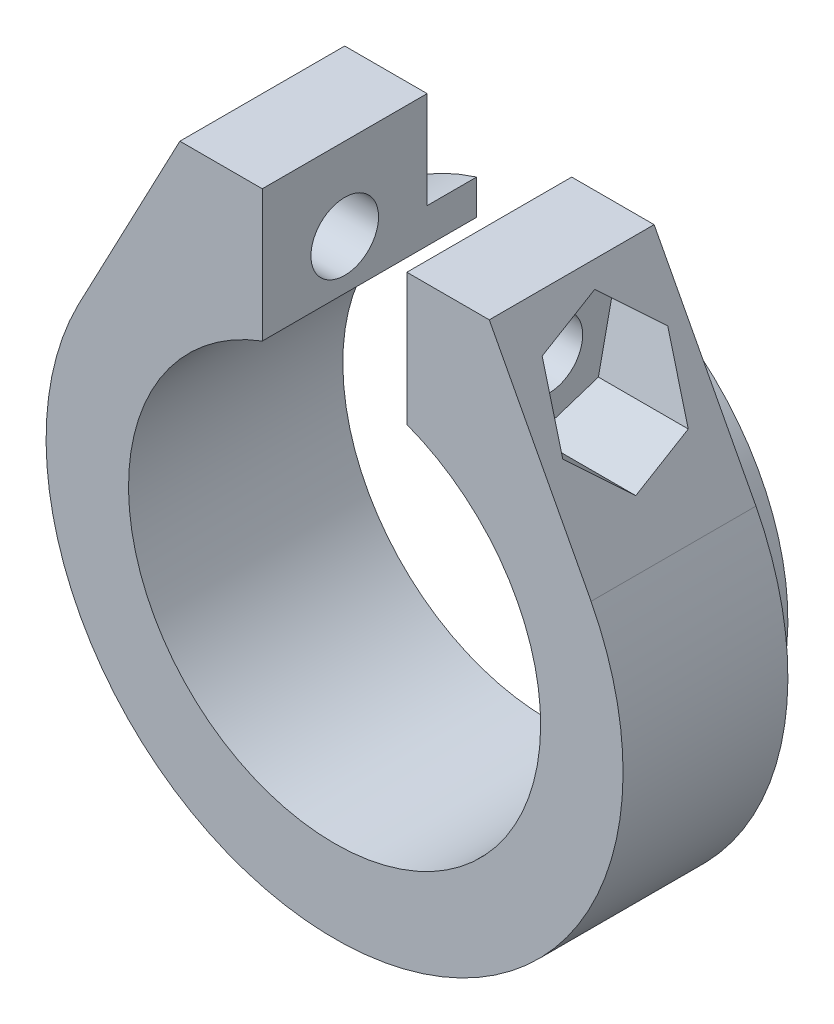
ISO-10303-21;
HEADER;
FILE_DESCRIPTION(('STEP AP214'),'2;1');
FILE_NAME('part.step','',(''),(''),'','','');
FILE_SCHEMA(('AUTOMOTIVE_DESIGN { 1 0 10303 214 1 1 1 1 }'));
ENDSEC;
DATA;
#1=APPLICATION_CONTEXT('core data for automotive mechanical design processes');
#2=APPLICATION_PROTOCOL_DEFINITION('international standard','automotive_design',2000,#1);
#3=PRODUCT_CONTEXT('',#1,'mechanical');
#4=PRODUCT('Part','Part','',(#3));
#5=PRODUCT_RELATED_PRODUCT_CATEGORY('part','',(#4));
#6=PRODUCT_DEFINITION_FORMATION('','',#4);
#7=PRODUCT_DEFINITION_CONTEXT('part definition',#1,'design');
#8=PRODUCT_DEFINITION('design','',#6,#7);
#9=PRODUCT_DEFINITION_SHAPE('','',#8);
#10=(LENGTH_UNIT() NAMED_UNIT(*) SI_UNIT(.MILLI.,.METRE.));
#11=(NAMED_UNIT(*) PLANE_ANGLE_UNIT() SI_UNIT($,.RADIAN.));
#12=(NAMED_UNIT(*) SI_UNIT($,.STERADIAN.) SOLID_ANGLE_UNIT());
#13=UNCERTAINTY_MEASURE_WITH_UNIT(LENGTH_MEASURE(1.E-05),#10,'distance_accuracy_value','');
#14=(GEOMETRIC_REPRESENTATION_CONTEXT(3) GLOBAL_UNCERTAINTY_ASSIGNED_CONTEXT((#13)) GLOBAL_UNIT_ASSIGNED_CONTEXT((#10,
#11,#12)) REPRESENTATION_CONTEXT('',''));
#15=CARTESIAN_POINT('',(0.,0.,0.));
#16=DIRECTION('',(0.,0.,1.));
#17=DIRECTION('',(1.,0.,0.));
#18=AXIS2_PLACEMENT_3D('',#15,#16,#17);
#19=CARTESIAN_POINT('',(-17.5,14.705801524784,5.));
#20=DIRECTION('',(1.,0.,0.));
#21=DIRECTION('',(0.,0.,-1.));
#22=AXIS2_PLACEMENT_3D('',#19,#20,#21);
#23=CYLINDRICAL_SURFACE('',#22,2.05);
#24=CARTESIAN_POINT('',(4.38454224091464,14.705801524784,5.));
#25=DIRECTION('',(1.,0.,0.));
#26=DIRECTION('',(0.,1.,0.));
#27=AXIS2_PLACEMENT_3D('',#24,#25,#26);
#28=CIRCLE('',#27,2.05);
#29=CARTESIAN_POINT('',(4.38454224091464,16.755801524784,5.));
#30=VERTEX_POINT('',#29);
#31=EDGE_CURVE('E232',#30,#30,#28,.T.);
#32=ORIENTED_EDGE('',*,*,#31,.F.);
#33=EDGE_LOOP('',(#32));
#34=FACE_BOUND('',#33,.T.);
#35=CARTESIAN_POINT('',(8.,14.705801524784,5.));
#36=DIRECTION('',(1.,0.,0.));
#37=DIRECTION('',(0.,0.,-1.));
#38=AXIS2_PLACEMENT_3D('',#35,#36,#37);
#39=CIRCLE('',#38,2.05);
#40=CARTESIAN_POINT('',(8.,14.705801524784,2.95));
#41=VERTEX_POINT('',#40);
#42=EDGE_CURVE('E211',#41,#41,#39,.F.);
#43=ORIENTED_EDGE('',*,*,#42,.F.);
#44=EDGE_LOOP('',(#43));
#45=FACE_BOUND('',#44,.T.);
#46=ADVANCED_FACE('F44',(#34,#45),#23,.F.);
#47=CARTESIAN_POINT('',(0.,0.,10.));
#48=DIRECTION('',(0.,0.,-1.));
#49=DIRECTION('',(-1.,0.,0.));
#50=AXIS2_PLACEMENT_3D('',#47,#48,#49);
#51=CYLINDRICAL_SURFACE('',#50,17.5);
#52=CARTESIAN_POINT('',(0.,0.,0.));
#53=DIRECTION('',(0.,0.,1.));
#54=DIRECTION('',(1.,0.,0.));
#55=AXIS2_PLACEMENT_3D('',#52,#53,#54);
#56=CIRCLE('',#55,17.5);
#57=CARTESIAN_POINT('',(-15.5608994388534,8.00677267404855,0.));
#58=VERTEX_POINT('',#57);
#59=CARTESIAN_POINT('',(15.5608994388534,8.00677267404855,0.));
#60=VERTEX_POINT('',#59);
#61=EDGE_CURVE('E236',#58,#60,#56,.T.);
#62=ORIENTED_EDGE('',*,*,#61,.T.);
#63=DIRECTION('',(0.,0.,-1.));
#64=VECTOR('',#63,1.);
#65=CARTESIAN_POINT('',(15.5608994388534,8.00677267404855,10.));
#66=LINE('',#65,#64);
#67=CARTESIAN_POINT('',(15.5608994388534,8.00677267404855,10.));
#68=VERTEX_POINT('',#67);
#69=EDGE_CURVE('E286',#68,#60,#66,.T.);
#70=ORIENTED_EDGE('',*,*,#69,.F.);
#71=CARTESIAN_POINT('',(0.,0.,10.));
#72=DIRECTION('',(0.,0.,1.));
#73=DIRECTION('',(1.,0.,0.));
#74=AXIS2_PLACEMENT_3D('',#71,#72,#73);
#75=CIRCLE('',#74,17.5);
#76=CARTESIAN_POINT('',(-15.5608994388534,8.00677267404855,10.));
#77=VERTEX_POINT('',#76);
#78=EDGE_CURVE('E237',#77,#68,#75,.T.);
#79=ORIENTED_EDGE('',*,*,#78,.F.);
#80=DIRECTION('',(0.,0.,-1.));
#81=VECTOR('',#80,1.);
#82=CARTESIAN_POINT('',(-15.5608994388534,8.00677267404855,10.));
#83=LINE('',#82,#81);
#84=EDGE_CURVE('E256',#77,#58,#83,.T.);
#85=ORIENTED_EDGE('',*,*,#84,.T.);
#86=EDGE_LOOP('',(#62,#70,#79,#85));
#87=FACE_BOUND('',#86,.T.);
#88=ADVANCED_FACE('F46',(#87),#51,.T.);
#89=CARTESIAN_POINT('',(15.5608994388534,8.00677267404855,10.));
#90=DIRECTION('',(-0.884326404159243,-0.466869158230422,0.));
#91=DIRECTION('',(0.466869158230422,-0.884326404159243,0.));
#92=AXIS2_PLACEMENT_3D('',#89,#90,#91);
#93=PLANE('',#92);
#94=DIRECTION('',(0.458850828402479,-0.869138378437038,0.184538333151124));
#95=VECTOR('',#94,1.);
#96=CARTESIAN_POINT('',(16.1668092173525,6.85908063609954,3.08801928125686));
#97=LINE('',#96,#95);
#98=CARTESIAN_POINT('',(11.3644480736843,15.955536649067,1.15662967534137));
#99=VERTEX_POINT('',#98);
#100=CARTESIAN_POINT('',(13.4515563998253,12.0022127496199,1.99601247203986));
#101=VERTEX_POINT('',#100);
#102=EDGE_CURVE('E289',#99,#101,#97,.T.);
#103=ORIENTED_EDGE('',*,*,#102,.T.);
#104=DIRECTION('',(0.16112078627816,-0.305189072897278,0.938562582896424));
#105=VECTOR('',#104,1.);
#106=CARTESIAN_POINT('',(14.9131582744826,9.23370018599896,10.5101518474291));
#107=LINE('',#106,#105);
#108=CARTESIAN_POINT('',(14.1113385602819,10.7524776253368,5.83938279669849));
#109=VERTEX_POINT('',#108);
#110=EDGE_CURVE('E48',#101,#109,#107,.T.);
#111=ORIENTED_EDGE('',*,*,#110,.T.);
#112=DIRECTION('',(-0.333013343699275,0.63078163887896,0.700868487643296));
#113=VECTOR('',#112,1.);
#114=CARTESIAN_POINT('',(13.877768961011,11.1948965776341,6.33095941036211));
#115=LINE('',#114,#113);
#116=CARTESIAN_POINT('',(12.6840123945975,13.4560664005009,8.84337032465863));
#117=VERTEX_POINT('',#116);
#118=EDGE_CURVE('E306',#109,#117,#115,.T.);
#119=ORIENTED_EDGE('',*,*,#118,.T.);
#120=DIRECTION('',(-0.458850828402479,0.869138378437038,-0.184538333151124));
#121=VECTOR('',#120,1.);
#122=CARTESIAN_POINT('',(15.560867060657,8.00683400363851,10.0003693577452));
#123=LINE('',#122,#121);
#124=CARTESIAN_POINT('',(10.5969040684565,17.4093902999481,8.00398752796013));
#125=VERTEX_POINT('',#124);
#126=EDGE_CURVE('E304',#117,#125,#123,.T.);
#127=ORIENTED_EDGE('',*,*,#126,.T.);
#128=DIRECTION('',(-0.16112078627816,0.305189072897278,-0.938562582896424));
#129=VECTOR('',#128,1.);
#130=CARTESIAN_POINT('',(11.4899581779318,15.7178000215384,13.2062161852131));
#131=LINE('',#130,#129);
#132=CARTESIAN_POINT('',(9.9371219079999,18.6591254242311,4.1606172033015));
#133=VERTEX_POINT('',#132);
#134=EDGE_CURVE('E301',#125,#133,#131,.T.);
#135=ORIENTED_EDGE('',*,*,#134,.T.);
#136=DIRECTION('',(0.333013343699275,-0.63078163887896,-0.700868487643296));
#137=VECTOR('',#136,1.);
#138=CARTESIAN_POINT('',(11.435502825422,15.8209473492709,1.00708600890118));
#139=LINE('',#138,#137);
#140=EDGE_CURVE('E298',#133,#99,#139,.T.);
#141=ORIENTED_EDGE('',*,*,#140,.T.);
#142=EDGE_LOOP('',(#103,#111,#119,#127,#135,#141));
#143=FACE_BOUND('',#142,.T.);
#144=DIRECTION('',(-0.466869158230422,0.884326404159243,0.));
#145=VECTOR('',#144,1.);
#146=CARTESIAN_POINT('',(15.5608994388534,8.00677267404855,0.));
#147=LINE('',#146,#145);
#148=CARTESIAN_POINT('',(9.38454224091464,19.705801524784,0.));
#149=VERTEX_POINT('',#148);
#150=EDGE_CURVE('E260',#60,#149,#147,.T.);
#151=ORIENTED_EDGE('',*,*,#150,.T.);
#152=DIRECTION('',(0.,0.,-1.));
#153=VECTOR('',#152,1.);
#154=CARTESIAN_POINT('',(9.38454224091464,19.705801524784,10.));
#155=LINE('',#154,#153);
#156=CARTESIAN_POINT('',(9.38454224091464,19.705801524784,10.));
#157=VERTEX_POINT('',#156);
#158=EDGE_CURVE('E283',#157,#149,#155,.T.);
#159=ORIENTED_EDGE('',*,*,#158,.F.);
#160=DIRECTION('',(-0.466869158230422,0.884326404159243,0.));
#161=VECTOR('',#160,1.);
#162=CARTESIAN_POINT('',(15.5608994388534,8.00677267404855,10.));
#163=LINE('',#162,#161);
#164=EDGE_CURVE('E241',#68,#157,#163,.T.);
#165=ORIENTED_EDGE('',*,*,#164,.F.);
#166=ORIENTED_EDGE('',*,*,#69,.T.);
#167=EDGE_LOOP('',(#151,#159,#165,#166));
#168=FACE_BOUND('',#167,.T.);
#169=ADVANCED_FACE('F311',(#143,#168),#93,.F.);
#170=CARTESIAN_POINT('',(9.38454224091464,19.705801524784,10.));
#171=DIRECTION('',(0.,-1.,0.));
#172=DIRECTION('',(0.,0.,-1.));
#173=AXIS2_PLACEMENT_3D('',#170,#171,#172);
#174=PLANE('',#173);
#175=DIRECTION('',(-1.,0.,0.));
#176=VECTOR('',#175,1.);
#177=CARTESIAN_POINT('',(9.38454224091464,19.705801524784,0.));
#178=LINE('',#177,#176);
#179=CARTESIAN_POINT('',(4.38454224091464,19.705801524784,0.));
#180=VERTEX_POINT('',#179);
#181=EDGE_CURVE('E262',#149,#180,#178,.T.);
#182=ORIENTED_EDGE('',*,*,#181,.T.);
#183=DIRECTION('',(0.,0.,-1.));
#184=VECTOR('',#183,1.);
#185=CARTESIAN_POINT('',(4.38454224091464,19.705801524784,10.));
#186=LINE('',#185,#184);
#187=CARTESIAN_POINT('',(4.38454224091464,19.705801524784,10.));
#188=VERTEX_POINT('',#187);
#189=EDGE_CURVE('E169',#188,#180,#186,.T.);
#190=ORIENTED_EDGE('',*,*,#189,.F.);
#191=DIRECTION('',(-1.,0.,0.));
#192=VECTOR('',#191,1.);
#193=CARTESIAN_POINT('',(9.38454224091464,19.705801524784,10.));
#194=LINE('',#193,#192);
#195=EDGE_CURVE('E244',#157,#188,#194,.T.);
#196=ORIENTED_EDGE('',*,*,#195,.F.);
#197=ORIENTED_EDGE('',*,*,#158,.T.);
#198=EDGE_LOOP('',(#182,#190,#196,#197));
#199=FACE_BOUND('',#198,.T.);
#200=ADVANCED_FACE('F384',(#199),#174,.F.);
#201=CARTESIAN_POINT('',(4.38454224091464,16.705801524784,10.));
#202=DIRECTION('',(1.,0.,0.));
#203=DIRECTION('',(0.,1.,0.));
#204=AXIS2_PLACEMENT_3D('',#201,#202,#203);
#205=PLANE('',#204);
#206=ORIENTED_EDGE('',*,*,#31,.T.);
#207=EDGE_LOOP('',(#206));
#208=FACE_BOUND('',#207,.T.);
#209=DIRECTION('',(0.,-1.,0.));
#210=VECTOR('',#209,1.);
#211=CARTESIAN_POINT('',(4.38454224091464,16.705801524784,0.));
#212=LINE('',#211,#210);
#213=CARTESIAN_POINT('',(4.38454224091464,13.8212079550825,0.));
#214=VERTEX_POINT('',#213);
#215=EDGE_CURVE('E265',#180,#214,#212,.T.);
#216=ORIENTED_EDGE('',*,*,#215,.T.);
#217=DIRECTION('',(0.,0.,1.));
#218=VECTOR('',#217,1.);
#219=CARTESIAN_POINT('',(4.38454224091464,13.8212079550825,-3.));
#220=LINE('',#219,#218);
#221=CARTESIAN_POINT('',(4.38454224091464,13.8212079550825,-3.));
#222=VERTEX_POINT('',#221);
#223=EDGE_CURVE('E68',#222,#214,#220,.T.);
#224=ORIENTED_EDGE('',*,*,#223,.F.);
#225=DIRECTION('',(0.,1.,0.));
#226=VECTOR('',#225,1.);
#227=CARTESIAN_POINT('',(4.38454224091465,11.705801524784,-3.));
#228=LINE('',#227,#226);
#229=CARTESIAN_POINT('',(4.38454224091465,11.705801524784,-3.));
#230=VERTEX_POINT('',#229);
#231=EDGE_CURVE('E173',#230,#222,#228,.T.);
#232=ORIENTED_EDGE('',*,*,#231,.F.);
#233=DIRECTION('',(0.,0.,-1.));
#234=VECTOR('',#233,1.);
#235=CARTESIAN_POINT('',(4.38454224091465,11.705801524784,10.));
#236=LINE('',#235,#234);
#237=CARTESIAN_POINT('',(4.38454224091465,11.705801524784,10.));
#238=VERTEX_POINT('',#237);
#239=EDGE_CURVE('E160',#238,#230,#236,.T.);
#240=ORIENTED_EDGE('',*,*,#239,.F.);
#241=DIRECTION('',(0.,-1.,0.));
#242=VECTOR('',#241,1.);
#243=CARTESIAN_POINT('',(4.38454224091464,19.705801524784,10.));
#244=LINE('',#243,#242);
#245=EDGE_CURVE('E246',#188,#238,#244,.T.);
#246=ORIENTED_EDGE('',*,*,#245,.F.);
#247=ORIENTED_EDGE('',*,*,#189,.T.);
#248=EDGE_LOOP('',(#216,#224,#232,#240,#246,#247));
#249=FACE_BOUND('',#248,.T.);
#250=ADVANCED_FACE('F175',(#208,#249),#205,.F.);
#251=CARTESIAN_POINT('',(0.,0.,10.));
#252=DIRECTION('',(0.,0.,-1.));
#253=DIRECTION('',(-1.,0.,0.));
#254=AXIS2_PLACEMENT_3D('',#251,#252,#253);
#255=CYLINDRICAL_SURFACE('',#254,12.5);
#256=CARTESIAN_POINT('',(0.,0.,-3.));
#257=DIRECTION('',(0.,0.,-1.));
#258=DIRECTION('',(-1.,0.,0.));
#259=AXIS2_PLACEMENT_3D('',#256,#257,#258);
#260=CIRCLE('',#259,12.5);
#261=CARTESIAN_POINT('',(-4.38454224091464,11.705801524784,-3.));
#262=VERTEX_POINT('',#261);
#263=EDGE_CURVE('E165',#230,#262,#260,.T.);
#264=ORIENTED_EDGE('',*,*,#263,.T.);
#265=DIRECTION('',(0.,0.,-1.));
#266=VECTOR('',#265,1.);
#267=CARTESIAN_POINT('',(-4.38454224091464,11.705801524784,10.));
#268=LINE('',#267,#266);
#269=CARTESIAN_POINT('',(-4.38454224091464,11.705801524784,10.));
#270=VERTEX_POINT('',#269);
#271=EDGE_CURVE('E170',#270,#262,#268,.T.);
#272=ORIENTED_EDGE('',*,*,#271,.F.);
#273=CARTESIAN_POINT('',(0.,0.,10.));
#274=DIRECTION('',(0.,0.,-1.));
#275=DIRECTION('',(1.,0.,0.));
#276=AXIS2_PLACEMENT_3D('',#273,#274,#275);
#277=CIRCLE('',#276,12.5);
#278=EDGE_CURVE('E166',#238,#270,#277,.T.);
#279=ORIENTED_EDGE('',*,*,#278,.F.);
#280=ORIENTED_EDGE('',*,*,#239,.T.);
#281=EDGE_LOOP('',(#264,#272,#279,#280));
#282=FACE_BOUND('',#281,.T.);
#283=ADVANCED_FACE('F162',(#282),#255,.F.);
#284=CARTESIAN_POINT('',(-4.38454224091464,19.705801524784,10.));
#285=DIRECTION('',(-1.,0.,0.));
#286=DIRECTION('',(0.,-1.,0.));
#287=AXIS2_PLACEMENT_3D('',#284,#285,#286);
#288=PLANE('',#287);
#289=CARTESIAN_POINT('',(-4.38454224091464,14.705801524784,5.));
#290=DIRECTION('',(-1.,0.,0.));
#291=DIRECTION('',(0.,-1.,0.));
#292=AXIS2_PLACEMENT_3D('',#289,#290,#291);
#293=CIRCLE('',#292,2.05);
#294=CARTESIAN_POINT('',(-4.38454224091463,12.655801524784,5.));
#295=VERTEX_POINT('',#294);
#296=EDGE_CURVE('E229',#295,#295,#293,.T.);
#297=ORIENTED_EDGE('',*,*,#296,.T.);
#298=EDGE_LOOP('',(#297));
#299=FACE_BOUND('',#298,.T.);
#300=ORIENTED_EDGE('',*,*,#271,.T.);
#301=DIRECTION('',(0.,-1.,0.));
#302=VECTOR('',#301,1.);
#303=CARTESIAN_POINT('',(-4.38454224091464,11.705801524784,-3.));
#304=LINE('',#303,#302);
#305=CARTESIAN_POINT('',(-4.38454224091464,13.8212079550825,-3.));
#306=VERTEX_POINT('',#305);
#307=EDGE_CURVE('E61',#306,#262,#304,.T.);
#308=ORIENTED_EDGE('',*,*,#307,.F.);
#309=DIRECTION('',(0.,0.,1.));
#310=VECTOR('',#309,1.);
#311=CARTESIAN_POINT('',(-4.38454224091464,13.8212079550825,-3.));
#312=LINE('',#311,#310);
#313=CARTESIAN_POINT('',(-4.38454224091464,13.8212079550825,0.));
#314=VERTEX_POINT('',#313);
#315=EDGE_CURVE('E182',#306,#314,#312,.T.);
#316=ORIENTED_EDGE('',*,*,#315,.T.);
#317=DIRECTION('',(0.,1.,0.));
#318=VECTOR('',#317,1.);
#319=CARTESIAN_POINT('',(-4.38454224091464,19.705801524784,0.));
#320=LINE('',#319,#318);
#321=CARTESIAN_POINT('',(-4.38454224091464,19.705801524784,0.));
#322=VERTEX_POINT('',#321);
#323=EDGE_CURVE('E267',#314,#322,#320,.T.);
#324=ORIENTED_EDGE('',*,*,#323,.T.);
#325=DIRECTION('',(0.,0.,-1.));
#326=VECTOR('',#325,1.);
#327=CARTESIAN_POINT('',(-4.38454224091464,19.705801524784,10.));
#328=LINE('',#327,#326);
#329=CARTESIAN_POINT('',(-4.38454224091464,19.705801524784,10.));
#330=VERTEX_POINT('',#329);
#331=EDGE_CURVE('E277',#330,#322,#328,.T.);
#332=ORIENTED_EDGE('',*,*,#331,.F.);
#333=DIRECTION('',(0.,1.,0.));
#334=VECTOR('',#333,1.);
#335=CARTESIAN_POINT('',(-4.38454224091464,16.705801524784,10.));
#336=LINE('',#335,#334);
#337=EDGE_CURVE('E250',#270,#330,#336,.T.);
#338=ORIENTED_EDGE('',*,*,#337,.F.);
#339=EDGE_LOOP('',(#300,#308,#316,#324,#332,#338));
#340=FACE_BOUND('',#339,.T.);
#341=ADVANCED_FACE('F372',(#299,#340),#288,.F.);
#342=CARTESIAN_POINT('',(-9.38454224091464,19.705801524784,10.));
#343=DIRECTION('',(0.,-1.,0.));
#344=DIRECTION('',(0.,0.,-1.));
#345=AXIS2_PLACEMENT_3D('',#342,#343,#344);
#346=PLANE('',#345);
#347=DIRECTION('',(-1.,0.,0.));
#348=VECTOR('',#347,1.);
#349=CARTESIAN_POINT('',(-9.38454224091464,19.705801524784,0.));
#350=LINE('',#349,#348);
#351=CARTESIAN_POINT('',(-9.38454224091464,19.705801524784,0.));
#352=VERTEX_POINT('',#351);
#353=EDGE_CURVE('E269',#322,#352,#350,.T.);
#354=ORIENTED_EDGE('',*,*,#353,.T.);
#355=DIRECTION('',(0.,0.,-1.));
#356=VECTOR('',#355,1.);
#357=CARTESIAN_POINT('',(-9.38454224091464,19.705801524784,10.));
#358=LINE('',#357,#356);
#359=CARTESIAN_POINT('',(-9.38454224091464,19.705801524784,10.));
#360=VERTEX_POINT('',#359);
#361=EDGE_CURVE('E274',#360,#352,#358,.T.);
#362=ORIENTED_EDGE('',*,*,#361,.F.);
#363=DIRECTION('',(-1.,0.,0.));
#364=VECTOR('',#363,1.);
#365=CARTESIAN_POINT('',(-9.38454224091464,19.705801524784,10.));
#366=LINE('',#365,#364);
#367=EDGE_CURVE('E252',#330,#360,#366,.T.);
#368=ORIENTED_EDGE('',*,*,#367,.F.);
#369=ORIENTED_EDGE('',*,*,#331,.T.);
#370=EDGE_LOOP('',(#354,#362,#368,#369));
#371=FACE_BOUND('',#370,.T.);
#372=ADVANCED_FACE('F374',(#371),#346,.F.);
#373=CARTESIAN_POINT('',(-15.5608994388534,8.00677267404855,10.));
#374=DIRECTION('',(0.884326404159243,-0.466869158230422,0.));
#375=DIRECTION('',(0.466869158230422,0.884326404159243,0.));
#376=AXIS2_PLACEMENT_3D('',#373,#374,#375);
#377=PLANE('',#376);
#378=CARTESIAN_POINT('',(-12.0242302341409,14.705801524784,5.));
#379=DIRECTION('',(0.884326404159243,-0.466869158230422,0.));
#380=DIRECTION('',(0.466869158230422,0.884326404159243,0.));
#381=AXIS2_PLACEMENT_3D('',#378,#379,#380);
#382=ELLIPSE('',#381,3.90127444320746,3.45);
#383=CARTESIAN_POINT('',(-10.2028455188148,18.155801524784,5.));
#384=VERTEX_POINT('',#383);
#385=EDGE_CURVE('E233',#384,#384,#382,.T.);
#386=ORIENTED_EDGE('',*,*,#385,.T.);
#387=EDGE_LOOP('',(#386));
#388=FACE_BOUND('',#387,.T.);
#389=DIRECTION('',(-0.466869158230422,-0.884326404159243,0.));
#390=VECTOR('',#389,1.);
#391=CARTESIAN_POINT('',(-15.5608994388534,8.00677267404855,0.));
#392=LINE('',#391,#390);
#393=EDGE_CURVE('E242',#352,#58,#392,.T.);
#394=ORIENTED_EDGE('',*,*,#393,.T.);
#395=ORIENTED_EDGE('',*,*,#84,.F.);
#396=DIRECTION('',(-0.466869158230422,-0.884326404159243,0.));
#397=VECTOR('',#396,1.);
#398=CARTESIAN_POINT('',(-15.5608994388534,8.00677267404855,10.));
#399=LINE('',#398,#397);
#400=EDGE_CURVE('E254',#360,#77,#399,.T.);
#401=ORIENTED_EDGE('',*,*,#400,.F.);
#402=ORIENTED_EDGE('',*,*,#361,.T.);
#403=EDGE_LOOP('',(#394,#395,#401,#402));
#404=FACE_BOUND('',#403,.T.);
#405=ADVANCED_FACE('F395',(#388,#404),#377,.F.);
#406=CARTESIAN_POINT('',(0.,0.,10.));
#407=DIRECTION('',(0.,0.,1.));
#408=DIRECTION('',(1.,0.,0.));
#409=AXIS2_PLACEMENT_3D('',#406,#407,#408);
#410=PLANE('',#409);
#411=ORIENTED_EDGE('',*,*,#78,.T.);
#412=ORIENTED_EDGE('',*,*,#164,.T.);
#413=ORIENTED_EDGE('',*,*,#195,.T.);
#414=ORIENTED_EDGE('',*,*,#245,.T.);
#415=ORIENTED_EDGE('',*,*,#278,.T.);
#416=ORIENTED_EDGE('',*,*,#337,.T.);
#417=ORIENTED_EDGE('',*,*,#367,.T.);
#418=ORIENTED_EDGE('',*,*,#400,.T.);
#419=EDGE_LOOP('',(#411,#412,#413,#414,#415,#416,#417,#418));
#420=FACE_BOUND('',#419,.T.);
#421=ADVANCED_FACE('F365',(#420),#410,.T.);
#422=CARTESIAN_POINT('',(0.,0.,0.));
#423=DIRECTION('',(0.,0.,1.));
#424=DIRECTION('',(1.,0.,0.));
#425=AXIS2_PLACEMENT_3D('',#422,#423,#424);
#426=PLANE('',#425);
#427=CARTESIAN_POINT('',(0.,0.,0.));
#428=DIRECTION('',(0.,0.,-1.));
#429=DIRECTION('',(-1.,0.,0.));
#430=AXIS2_PLACEMENT_3D('',#427,#428,#429);
#431=CIRCLE('',#430,14.5);
#432=EDGE_CURVE('E11',#214,#314,#431,.T.);
#433=ORIENTED_EDGE('',*,*,#432,.F.);
#434=ORIENTED_EDGE('',*,*,#215,.F.);
#435=ORIENTED_EDGE('',*,*,#181,.F.);
#436=ORIENTED_EDGE('',*,*,#150,.F.);
#437=ORIENTED_EDGE('',*,*,#61,.F.);
#438=ORIENTED_EDGE('',*,*,#393,.F.);
#439=ORIENTED_EDGE('',*,*,#353,.F.);
#440=ORIENTED_EDGE('',*,*,#323,.F.);
#441=EDGE_LOOP('',(#433,#434,#435,#436,#437,#438,#439,#440));
#442=FACE_BOUND('',#441,.T.);
#443=ADVANCED_FACE('F357',(#442),#426,.F.);
#444=CARTESIAN_POINT('',(-8.,14.705801524784,5.));
#445=DIRECTION('',(1.,0.,0.));
#446=DIRECTION('',(0.,0.,-1.));
#447=AXIS2_PLACEMENT_3D('',#444,#445,#446);
#448=CIRCLE('',#447,2.05);
#449=CARTESIAN_POINT('',(-8.,14.705801524784,2.95));
#450=VERTEX_POINT('',#449);
#451=EDGE_CURVE('E228',#450,#450,#448,.F.);
#452=ORIENTED_EDGE('',*,*,#451,.T.);
#453=EDGE_LOOP('',(#452));
#454=FACE_BOUND('',#453,.T.);
#455=ORIENTED_EDGE('',*,*,#296,.F.);
#456=EDGE_LOOP('',(#455));
#457=FACE_BOUND('',#456,.T.);
#458=ADVANCED_FACE('F346',(#454,#457),#23,.F.);
#459=CARTESIAN_POINT('',(-17.5,14.705801524784,5.));
#460=DIRECTION('',(1.,0.,0.));
#461=DIRECTION('',(0.,0.,-1.));
#462=AXIS2_PLACEMENT_3D('',#459,#460,#461);
#463=CYLINDRICAL_SURFACE('',#462,3.45);
#464=CARTESIAN_POINT('',(-8.,14.705801524784,5.));
#465=DIRECTION('',(1.,0.,0.));
#466=DIRECTION('',(0.,0.,-1.));
#467=AXIS2_PLACEMENT_3D('',#464,#465,#466);
#468=CIRCLE('',#467,3.45);
#469=CARTESIAN_POINT('',(-8.,14.705801524784,1.55));
#470=VERTEX_POINT('',#469);
#471=EDGE_CURVE('E225',#470,#470,#468,.T.);
#472=ORIENTED_EDGE('',*,*,#471,.T.);
#473=EDGE_LOOP('',(#472));
#474=FACE_BOUND('',#473,.T.);
#475=ORIENTED_EDGE('',*,*,#385,.F.);
#476=EDGE_LOOP('',(#475));
#477=FACE_BOUND('',#476,.T.);
#478=ADVANCED_FACE('F356',(#474,#477),#463,.F.);
#479=CARTESIAN_POINT('',(-8.,14.705801524784,5.));
#480=DIRECTION('',(1.,0.,0.));
#481=DIRECTION('',(0.,0.,-1.));
#482=AXIS2_PLACEMENT_3D('',#479,#480,#481);
#483=PLANE('',#482);
#484=ORIENTED_EDGE('',*,*,#471,.F.);
#485=EDGE_LOOP('',(#484));
#486=FACE_BOUND('',#485,.T.);
#487=ORIENTED_EDGE('',*,*,#451,.F.);
#488=EDGE_LOOP('',(#487));
#489=FACE_BOUND('',#488,.T.);
#490=ADVANCED_FACE('F363',(#486,#489),#483,.F.);
#491=CARTESIAN_POINT('',(8.,10.7524776253368,5.83938279669849));
#492=DIRECTION('',(0.,-0.950987524944462,-0.309229247323091));
#493=DIRECTION('',(0.,0.309229247323091,-0.950987524944462));
#494=AXIS2_PLACEMENT_3D('',#491,#492,#493);
#495=PLANE('',#494);
#496=DIRECTION('',(1.,0.,0.));
#497=VECTOR('',#496,1.);
#498=CARTESIAN_POINT('',(8.,12.0022127496199,1.99601247203986));
#499=LINE('',#498,#497);
#500=CARTESIAN_POINT('',(8.,12.0022127496199,1.99601247203986));
#501=VERTEX_POINT('',#500);
#502=EDGE_CURVE('E207',#501,#101,#499,.T.);
#503=ORIENTED_EDGE('',*,*,#502,.F.);
#504=DIRECTION('',(0.,0.309229247323091,-0.950987524944462));
#505=VECTOR('',#504,1.);
#506=CARTESIAN_POINT('',(8.,10.7524776253368,5.83938279669849));
#507=LINE('',#506,#505);
#508=CARTESIAN_POINT('',(8.,10.7524776253368,5.83938279669849));
#509=VERTEX_POINT('',#508);
#510=EDGE_CURVE('E185',#509,#501,#507,.T.);
#511=ORIENTED_EDGE('',*,*,#510,.F.);
#512=DIRECTION('',(1.,0.,0.));
#513=VECTOR('',#512,1.);
#514=CARTESIAN_POINT('',(8.,10.7524776253368,5.83938279669849));
#515=LINE('',#514,#513);
#516=EDGE_CURVE('E208',#509,#109,#515,.T.);
#517=ORIENTED_EDGE('',*,*,#516,.T.);
#518=ORIENTED_EDGE('',*,*,#110,.F.);
#519=EDGE_LOOP('',(#503,#511,#517,#518));
#520=FACE_BOUND('',#519,.T.);
#521=ADVANCED_FACE('F314',(#520),#495,.F.);
#522=CARTESIAN_POINT('',(8.,13.4560664005009,8.84337032465863));
#523=DIRECTION('',(0.,-0.743294146247169,0.668964731622446));
#524=DIRECTION('',(0.,-0.668964731622446,-0.743294146247169));
#525=AXIS2_PLACEMENT_3D('',#522,#523,#524);
#526=PLANE('',#525);
#527=ORIENTED_EDGE('',*,*,#516,.F.);
#528=DIRECTION('',(0.,-0.668964731622446,-0.743294146247169));
#529=VECTOR('',#528,1.);
#530=CARTESIAN_POINT('',(8.,13.4560664005009,8.84337032465863));
#531=LINE('',#530,#529);
#532=CARTESIAN_POINT('',(8.,13.4560664005009,8.84337032465863));
#533=VERTEX_POINT('',#532);
#534=EDGE_CURVE('E204',#533,#509,#531,.T.);
#535=ORIENTED_EDGE('',*,*,#534,.F.);
#536=DIRECTION('',(1.,0.,0.));
#537=VECTOR('',#536,1.);
#538=CARTESIAN_POINT('',(8.,13.4560664005009,8.84337032465863));
#539=LINE('',#538,#537);
#540=EDGE_CURVE('E212',#533,#117,#539,.T.);
#541=ORIENTED_EDGE('',*,*,#540,.T.);
#542=ORIENTED_EDGE('',*,*,#118,.F.);
#543=EDGE_LOOP('',(#527,#535,#541,#542));
#544=FACE_BOUND('',#543,.T.);
#545=ADVANCED_FACE('F319',(#544),#526,.F.);
#546=CARTESIAN_POINT('',(8.,17.4093902999481,8.00398752796013));
#547=DIRECTION('',(0.,0.207693378697294,0.978193978945538));
#548=DIRECTION('',(0.,-0.978193978945538,0.207693378697294));
#549=AXIS2_PLACEMENT_3D('',#546,#547,#548);
#550=PLANE('',#549);
#551=ORIENTED_EDGE('',*,*,#540,.F.);
#552=DIRECTION('',(0.,-0.978193978945537,0.207693378697294));
#553=VECTOR('',#552,1.);
#554=CARTESIAN_POINT('',(8.,17.4093902999481,8.00398752796013));
#555=LINE('',#554,#553);
#556=CARTESIAN_POINT('',(8.,17.4093902999481,8.00398752796013));
#557=VERTEX_POINT('',#556);
#558=EDGE_CURVE('E201',#557,#533,#555,.T.);
#559=ORIENTED_EDGE('',*,*,#558,.F.);
#560=DIRECTION('',(1.,0.,0.));
#561=VECTOR('',#560,1.);
#562=CARTESIAN_POINT('',(8.,17.4093902999481,8.00398752796013));
#563=LINE('',#562,#561);
#564=EDGE_CURVE('E215',#557,#125,#563,.T.);
#565=ORIENTED_EDGE('',*,*,#564,.T.);
#566=ORIENTED_EDGE('',*,*,#126,.F.);
#567=EDGE_LOOP('',(#551,#559,#565,#566));
#568=FACE_BOUND('',#567,.T.);
#569=ADVANCED_FACE('F322',(#568),#550,.F.);
#570=CARTESIAN_POINT('',(8.,18.6591254242311,4.1606172033015));
#571=DIRECTION('',(0.,0.950987524944462,0.309229247323091));
#572=DIRECTION('',(0.,-0.309229247323091,0.950987524944462));
#573=AXIS2_PLACEMENT_3D('',#570,#571,#572);
#574=PLANE('',#573);
#575=ORIENTED_EDGE('',*,*,#564,.F.);
#576=DIRECTION('',(0.,-0.309229247323091,0.950987524944462));
#577=VECTOR('',#576,1.);
#578=CARTESIAN_POINT('',(8.,18.6591254242311,4.1606172033015));
#579=LINE('',#578,#577);
#580=CARTESIAN_POINT('',(8.,18.6591254242311,4.1606172033015));
#581=VERTEX_POINT('',#580);
#582=EDGE_CURVE('E198',#581,#557,#579,.T.);
#583=ORIENTED_EDGE('',*,*,#582,.F.);
#584=DIRECTION('',(1.,0.,0.));
#585=VECTOR('',#584,1.);
#586=CARTESIAN_POINT('',(8.,18.6591254242311,4.1606172033015));
#587=LINE('',#586,#585);
#588=EDGE_CURVE('E218',#581,#133,#587,.T.);
#589=ORIENTED_EDGE('',*,*,#588,.T.);
#590=ORIENTED_EDGE('',*,*,#134,.F.);
#591=EDGE_LOOP('',(#575,#583,#589,#590));
#592=FACE_BOUND('',#591,.T.);
#593=ADVANCED_FACE('F329',(#592),#574,.F.);
#594=CARTESIAN_POINT('',(8.,15.955536649067,1.15662967534137));
#595=DIRECTION('',(0.,0.743294146247169,-0.668964731622446));
#596=DIRECTION('',(0.,0.668964731622446,0.743294146247169));
#597=AXIS2_PLACEMENT_3D('',#594,#595,#596);
#598=PLANE('',#597);
#599=ORIENTED_EDGE('',*,*,#588,.F.);
#600=DIRECTION('',(0.,0.668964731622446,0.743294146247169));
#601=VECTOR('',#600,1.);
#602=CARTESIAN_POINT('',(8.,15.955536649067,1.15662967534137));
#603=LINE('',#602,#601);
#604=CARTESIAN_POINT('',(8.,15.955536649067,1.15662967534137));
#605=VERTEX_POINT('',#604);
#606=EDGE_CURVE('E195',#605,#581,#603,.T.);
#607=ORIENTED_EDGE('',*,*,#606,.F.);
#608=DIRECTION('',(1.,0.,0.));
#609=VECTOR('',#608,1.);
#610=CARTESIAN_POINT('',(8.,15.955536649067,1.15662967534137));
#611=LINE('',#610,#609);
#612=EDGE_CURVE('E221',#605,#99,#611,.T.);
#613=ORIENTED_EDGE('',*,*,#612,.T.);
#614=ORIENTED_EDGE('',*,*,#140,.F.);
#615=EDGE_LOOP('',(#599,#607,#613,#614));
#616=FACE_BOUND('',#615,.T.);
#617=ADVANCED_FACE('F331',(#616),#598,.F.);
#618=CARTESIAN_POINT('',(8.,12.0022127496199,1.99601247203986));
#619=DIRECTION('',(0.,-0.207693378697293,-0.978193978945538));
#620=DIRECTION('',(0.,0.978193978945538,-0.207693378697293));
#621=AXIS2_PLACEMENT_3D('',#618,#619,#620);
#622=PLANE('',#621);
#623=ORIENTED_EDGE('',*,*,#612,.F.);
#624=DIRECTION('',(0.,0.978193978945538,-0.207693378697293));
#625=VECTOR('',#624,1.);
#626=CARTESIAN_POINT('',(8.,12.0022127496199,1.99601247203986));
#627=LINE('',#626,#625);
#628=EDGE_CURVE('E192',#501,#605,#627,.T.);
#629=ORIENTED_EDGE('',*,*,#628,.F.);
#630=ORIENTED_EDGE('',*,*,#502,.T.);
#631=ORIENTED_EDGE('',*,*,#102,.F.);
#632=EDGE_LOOP('',(#623,#629,#630,#631));
#633=FACE_BOUND('',#632,.T.);
#634=ADVANCED_FACE('F333',(#633),#622,.F.);
#635=CARTESIAN_POINT('',(8.,0.,0.));
#636=DIRECTION('',(1.,0.,0.));
#637=DIRECTION('',(0.,0.,-1.));
#638=AXIS2_PLACEMENT_3D('',#635,#636,#637);
#639=PLANE('',#638);
#640=ORIENTED_EDGE('',*,*,#510,.T.);
#641=ORIENTED_EDGE('',*,*,#628,.T.);
#642=ORIENTED_EDGE('',*,*,#606,.T.);
#643=ORIENTED_EDGE('',*,*,#582,.T.);
#644=ORIENTED_EDGE('',*,*,#558,.T.);
#645=ORIENTED_EDGE('',*,*,#534,.T.);
#646=EDGE_LOOP('',(#640,#641,#642,#643,#644,#645));
#647=FACE_BOUND('',#646,.T.);
#648=ORIENTED_EDGE('',*,*,#42,.T.);
#649=EDGE_LOOP('',(#648));
#650=FACE_BOUND('',#649,.T.);
#651=ADVANCED_FACE('F324',(#647,#650),#639,.T.);
#652=CARTESIAN_POINT('',(0.,0.,-3.));
#653=DIRECTION('',(0.,0.,-1.));
#654=DIRECTION('',(-1.,0.,0.));
#655=AXIS2_PLACEMENT_3D('',#652,#653,#654);
#656=PLANE('',#655);
#657=ORIENTED_EDGE('',*,*,#307,.T.);
#658=ORIENTED_EDGE('',*,*,#263,.F.);
#659=ORIENTED_EDGE('',*,*,#231,.T.);
#660=CARTESIAN_POINT('',(0.,0.,-3.));
#661=DIRECTION('',(0.,0.,-1.));
#662=DIRECTION('',(-1.,0.,0.));
#663=AXIS2_PLACEMENT_3D('',#660,#661,#662);
#664=CIRCLE('',#663,14.5);
#665=EDGE_CURVE('E181',#222,#306,#664,.T.);
#666=ORIENTED_EDGE('',*,*,#665,.T.);
#667=EDGE_LOOP('',(#657,#658,#659,#666));
#668=FACE_BOUND('',#667,.T.);
#669=ADVANCED_FACE('F179',(#668),#656,.T.);
#670=CARTESIAN_POINT('',(0.,0.,-3.));
#671=DIRECTION('',(0.,0.,1.));
#672=DIRECTION('',(1.,0.,0.));
#673=AXIS2_PLACEMENT_3D('',#670,#671,#672);
#674=CYLINDRICAL_SURFACE('',#673,14.5);
#675=ORIENTED_EDGE('',*,*,#432,.T.);
#676=ORIENTED_EDGE('',*,*,#315,.F.);
#677=ORIENTED_EDGE('',*,*,#665,.F.);
#678=ORIENTED_EDGE('',*,*,#223,.T.);
#679=EDGE_LOOP('',(#675,#676,#677,#678));
#680=FACE_BOUND('',#679,.T.);
#681=ADVANCED_FACE('F390',(#680),#674,.T.);
#682=CLOSED_SHELL('',(#46,#88,#169,#200,#250,#283,#341,#372,#405,#421,#443,#458,#478,#490,#521,
#545,#569,#593,#617,#634,#651,#669,#681));
#683=MANIFOLD_SOLID_BREP('B2',#682);
#684=ADVANCED_BREP_SHAPE_REPRESENTATION('',(#18,#683),#14);
#685=SHAPE_DEFINITION_REPRESENTATION(#9,#684);
ENDSEC;
END-ISO-10303-21;
